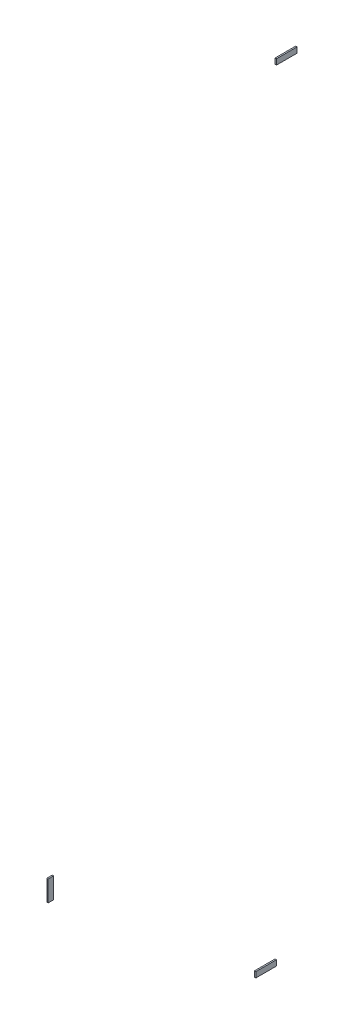
ISO-10303-21;
HEADER;
FILE_DESCRIPTION(('STEP AP214'),'2;1');
FILE_NAME('part.step','',(''),(''),'','','');
FILE_SCHEMA(('AUTOMOTIVE_DESIGN { 1 0 10303 214 1 1 1 1 }'));
ENDSEC;
DATA;
#1=APPLICATION_CONTEXT('core data for automotive mechanical design processes');
#2=APPLICATION_PROTOCOL_DEFINITION('international standard','automotive_design',2000,#1);
#3=PRODUCT_CONTEXT('',#1,'mechanical');
#4=PRODUCT('Part','Part','',(#3));
#5=PRODUCT_RELATED_PRODUCT_CATEGORY('part','',(#4));
#6=PRODUCT_DEFINITION_FORMATION('','',#4);
#7=PRODUCT_DEFINITION_CONTEXT('part definition',#1,'design');
#8=PRODUCT_DEFINITION('design','',#6,#7);
#9=PRODUCT_DEFINITION_SHAPE('','',#8);
#10=(LENGTH_UNIT() NAMED_UNIT(*) SI_UNIT(.MILLI.,.METRE.));
#11=(NAMED_UNIT(*) PLANE_ANGLE_UNIT() SI_UNIT($,.RADIAN.));
#12=(NAMED_UNIT(*) SI_UNIT($,.STERADIAN.) SOLID_ANGLE_UNIT());
#13=UNCERTAINTY_MEASURE_WITH_UNIT(LENGTH_MEASURE(1.E-05),#10,'distance_accuracy_value','');
#14=(GEOMETRIC_REPRESENTATION_CONTEXT(3) GLOBAL_UNCERTAINTY_ASSIGNED_CONTEXT((#13)) GLOBAL_UNIT_ASSIGNED_CONTEXT((#10,
#11,#12)) REPRESENTATION_CONTEXT('',''));
#15=CARTESIAN_POINT('',(0.,0.,0.));
#16=DIRECTION('',(0.,0.,1.));
#17=DIRECTION('',(1.,0.,0.));
#18=AXIS2_PLACEMENT_3D('',#15,#16,#17);
#19=CARTESIAN_POINT('',(113.80183648763,26.9498798221227,74.0750036621569));
#20=DIRECTION('',(-1.,0.,0.));
#21=DIRECTION('',(0.,0.,1.));
#22=AXIS2_PLACEMENT_3D('',#19,#20,#21);
#23=PLANE('',#22);
#24=DIRECTION('',(0.,1.,0.));
#25=VECTOR('',#24,1.);
#26=CARTESIAN_POINT('',(113.80183648763,20.3498798221227,75.575003662157));
#27=LINE('',#26,#25);
#28=CARTESIAN_POINT('',(113.80183648763,26.5498798221227,75.5750036621569));
#29=VERTEX_POINT('',#28);
#30=CARTESIAN_POINT('',(113.80183648763,27.3498798221227,75.5750036621569));
#31=VERTEX_POINT('',#30);
#32=EDGE_CURVE('P0_E11',#29,#31,#27,.T.);
#33=ORIENTED_EDGE('',*,*,#32,.T.);
#34=DIRECTION('',(0.,0.,-1.));
#35=VECTOR('',#34,1.);
#36=CARTESIAN_POINT('',(113.80183648763,27.3498798221227,75.5750036621569));
#37=LINE('',#36,#35);
#38=CARTESIAN_POINT('',(113.80183648763,27.3498798221227,72.5750036621568));
#39=VERTEX_POINT('',#38);
#40=EDGE_CURVE('P0_E57',#31,#39,#37,.T.);
#41=ORIENTED_EDGE('',*,*,#40,.T.);
#42=DIRECTION('',(0.,-1.,0.));
#43=VECTOR('',#42,1.);
#44=CARTESIAN_POINT('',(113.80183648763,27.3498798221227,72.5750036621568));
#45=LINE('',#44,#43);
#46=CARTESIAN_POINT('',(113.80183648763,26.5498798221227,72.5750036621569));
#47=VERTEX_POINT('',#46);
#48=EDGE_CURVE('P0_E60',#39,#47,#45,.T.);
#49=ORIENTED_EDGE('',*,*,#48,.T.);
#50=DIRECTION('',(0.,0.,1.));
#51=VECTOR('',#50,1.);
#52=CARTESIAN_POINT('',(113.80183648763,26.5498798221227,75.5750036621569));
#53=LINE('',#52,#51);
#54=EDGE_CURVE('P0_E111',#47,#29,#53,.T.);
#55=ORIENTED_EDGE('',*,*,#54,.T.);
#56=EDGE_LOOP('',(#33,#41,#49,#55));
#57=FACE_BOUND('',#56,.T.);
#58=ADVANCED_FACE('P0_F17',(#57),#23,.T.);
#59=CARTESIAN_POINT('',(114.00183648763,26.9498798221227,74.0750036621569));
#60=DIRECTION('',(1.,0.,0.));
#61=DIRECTION('',(0.,1.,0.));
#62=AXIS2_PLACEMENT_3D('',#59,#60,#61);
#63=PLANE('',#62);
#64=DIRECTION('',(0.,1.,0.));
#65=VECTOR('',#64,1.);
#66=CARTESIAN_POINT('',(114.00183648763,20.3498798221227,75.575003662157));
#67=LINE('',#66,#65);
#68=CARTESIAN_POINT('',(114.00183648763,26.5498798221227,75.5750036621569));
#69=VERTEX_POINT('',#68);
#70=CARTESIAN_POINT('',(114.00183648763,27.3498798221227,75.5750036621569));
#71=VERTEX_POINT('',#70);
#72=EDGE_CURVE('P0_E26',#69,#71,#67,.T.);
#73=ORIENTED_EDGE('',*,*,#72,.F.);
#74=DIRECTION('',(0.,0.,-1.));
#75=VECTOR('',#74,1.);
#76=CARTESIAN_POINT('',(114.00183648763,26.5498798221227,75.5750036621569));
#77=LINE('',#76,#75);
#78=CARTESIAN_POINT('',(114.00183648763,26.5498798221227,72.5750036621569));
#79=VERTEX_POINT('',#78);
#80=EDGE_CURVE('P0_E108',#69,#79,#77,.T.);
#81=ORIENTED_EDGE('',*,*,#80,.T.);
#82=DIRECTION('',(0.,-1.,0.));
#83=VECTOR('',#82,1.);
#84=CARTESIAN_POINT('',(114.00183648763,27.3498798221227,72.5750036621568));
#85=LINE('',#84,#83);
#86=CARTESIAN_POINT('',(114.00183648763,27.3498798221227,72.5750036621568));
#87=VERTEX_POINT('',#86);
#88=EDGE_CURVE('P0_E82',#87,#79,#85,.T.);
#89=ORIENTED_EDGE('',*,*,#88,.F.);
#90=DIRECTION('',(0.,0.,-1.));
#91=VECTOR('',#90,1.);
#92=CARTESIAN_POINT('',(114.00183648763,27.3498798221227,75.5750036621569));
#93=LINE('',#92,#91);
#94=EDGE_CURVE('P0_E66',#71,#87,#93,.T.);
#95=ORIENTED_EDGE('',*,*,#94,.F.);
#96=EDGE_LOOP('',(#73,#81,#89,#95));
#97=FACE_BOUND('',#96,.T.);
#98=ADVANCED_FACE('P0_F107',(#97),#63,.T.);
#99=CARTESIAN_POINT('',(114.00183648763,26.5498798221227,75.5750036621569));
#100=DIRECTION('',(0.,0.,1.));
#101=DIRECTION('',(0.,-1.,0.));
#102=AXIS2_PLACEMENT_3D('',#99,#100,#101);
#103=PLANE('',#102);
#104=ORIENTED_EDGE('',*,*,#72,.T.);
#105=DIRECTION('',(-1.,0.,0.));
#106=VECTOR('',#105,1.);
#107=CARTESIAN_POINT('',(114.00183648763,27.3498798221227,75.5750036621569));
#108=LINE('',#107,#106);
#109=EDGE_CURVE('P0_E65',#71,#31,#108,.T.);
#110=ORIENTED_EDGE('',*,*,#109,.T.);
#111=ORIENTED_EDGE('',*,*,#32,.F.);
#112=DIRECTION('',(-1.,0.,0.));
#113=VECTOR('',#112,1.);
#114=CARTESIAN_POINT('',(114.00183648763,26.5498798221227,75.5750036621569));
#115=LINE('',#114,#113);
#116=EDGE_CURVE('P0_E103',#69,#29,#115,.T.);
#117=ORIENTED_EDGE('',*,*,#116,.F.);
#118=EDGE_LOOP('',(#104,#110,#111,#117));
#119=FACE_BOUND('',#118,.T.);
#120=ADVANCED_FACE('P0_F100',(#119),#103,.T.);
#121=CARTESIAN_POINT('',(114.00183648763,27.3498798221227,75.5750036621569));
#122=DIRECTION('',(0.,1.,0.));
#123=DIRECTION('',(0.,0.,-1.));
#124=AXIS2_PLACEMENT_3D('',#121,#122,#123);
#125=PLANE('',#124);
#126=ORIENTED_EDGE('',*,*,#94,.T.);
#127=DIRECTION('',(-1.,0.,0.));
#128=VECTOR('',#127,1.);
#129=CARTESIAN_POINT('',(114.00183648763,27.3498798221227,72.5750036621568));
#130=LINE('',#129,#128);
#131=EDGE_CURVE('P0_E69',#87,#39,#130,.T.);
#132=ORIENTED_EDGE('',*,*,#131,.T.);
#133=ORIENTED_EDGE('',*,*,#40,.F.);
#134=ORIENTED_EDGE('',*,*,#109,.F.);
#135=EDGE_LOOP('',(#126,#132,#133,#134));
#136=FACE_BOUND('',#135,.T.);
#137=ADVANCED_FACE('P0_F70',(#136),#125,.T.);
#138=CARTESIAN_POINT('',(114.00183648763,27.3498798221227,72.5750036621568));
#139=DIRECTION('',(0.,0.,-1.));
#140=DIRECTION('',(0.,-1.,0.));
#141=AXIS2_PLACEMENT_3D('',#138,#139,#140);
#142=PLANE('',#141);
#143=ORIENTED_EDGE('',*,*,#88,.T.);
#144=DIRECTION('',(-1.,0.,0.));
#145=VECTOR('',#144,1.);
#146=CARTESIAN_POINT('',(114.00183648763,26.5498798221227,72.5750036621569));
#147=LINE('',#146,#145);
#148=EDGE_CURVE('P0_E79',#79,#47,#147,.T.);
#149=ORIENTED_EDGE('',*,*,#148,.T.);
#150=ORIENTED_EDGE('',*,*,#48,.F.);
#151=ORIENTED_EDGE('',*,*,#131,.F.);
#152=EDGE_LOOP('',(#143,#149,#150,#151));
#153=FACE_BOUND('',#152,.T.);
#154=ADVANCED_FACE('P0_F77',(#153),#142,.T.);
#155=CARTESIAN_POINT('',(114.00183648763,26.5498798221227,72.5750036621569));
#156=DIRECTION('',(0.,-1.,0.));
#157=DIRECTION('',(-1.,0.,0.));
#158=AXIS2_PLACEMENT_3D('',#155,#156,#157);
#159=PLANE('',#158);
#160=ORIENTED_EDGE('',*,*,#80,.F.);
#161=ORIENTED_EDGE('',*,*,#116,.T.);
#162=ORIENTED_EDGE('',*,*,#54,.F.);
#163=ORIENTED_EDGE('',*,*,#148,.F.);
#164=EDGE_LOOP('',(#160,#161,#162,#163));
#165=FACE_BOUND('',#164,.T.);
#166=ADVANCED_FACE('P0_F110',(#165),#159,.T.);
#167=CLOSED_SHELL('',(#58,#98,#120,#137,#154,#166));
#168=MANIFOLD_SOLID_BREP('P0_B1',#167);
#169=CARTESIAN_POINT('',(113.80183648763,-86.2501201778774,77.0750036621583));
#170=DIRECTION('',(-1.,0.,0.));
#171=DIRECTION('',(0.,0.,1.));
#172=AXIS2_PLACEMENT_3D('',#169,#170,#171);
#173=PLANE('',#172);
#174=DIRECTION('',(0.,0.,1.));
#175=VECTOR('',#174,1.);
#176=CARTESIAN_POINT('',(113.80183648763,-86.6501201778774,78.5750036621584));
#177=LINE('',#176,#175);
#178=CARTESIAN_POINT('',(113.80183648763,-86.6501201778775,75.5750036621582));
#179=VERTEX_POINT('',#178);
#180=CARTESIAN_POINT('',(113.80183648763,-86.6501201778774,78.5750036621584));
#181=VERTEX_POINT('',#180);
#182=EDGE_CURVE('P1_E11',#179,#181,#177,.T.);
#183=ORIENTED_EDGE('',*,*,#182,.T.);
#184=DIRECTION('',(0.,1.,0.));
#185=VECTOR('',#184,1.);
#186=CARTESIAN_POINT('',(113.80183648763,-86.6501201778774,78.5750036621584));
#187=LINE('',#186,#185);
#188=CARTESIAN_POINT('',(113.80183648763,-85.8501201778774,78.5750036621584));
#189=VERTEX_POINT('',#188);
#190=EDGE_CURVE('P1_E115',#181,#189,#187,.T.);
#191=ORIENTED_EDGE('',*,*,#190,.T.);
#192=DIRECTION('',(0.,0.,-1.));
#193=VECTOR('',#192,1.);
#194=CARTESIAN_POINT('',(113.80183648763,-85.8501201778774,78.5750036621584));
#195=LINE('',#194,#193);
#196=CARTESIAN_POINT('',(113.80183648763,-85.8501201778775,75.5750036621582));
#197=VERTEX_POINT('',#196);
#198=EDGE_CURVE('P1_E65',#189,#197,#195,.T.);
#199=ORIENTED_EDGE('',*,*,#198,.T.);
#200=DIRECTION('',(0.,-1.,0.));
#201=VECTOR('',#200,1.);
#202=CARTESIAN_POINT('',(113.80183648763,-83.6501201778775,75.5750036621582));
#203=LINE('',#202,#201);
#204=EDGE_CURVE('P1_E94',#197,#179,#203,.T.);
#205=ORIENTED_EDGE('',*,*,#204,.T.);
#206=EDGE_LOOP('',(#183,#191,#199,#205));
#207=FACE_BOUND('',#206,.T.);
#208=ADVANCED_FACE('P1_F17',(#207),#173,.T.);
#209=CARTESIAN_POINT('',(114.00183648763,-86.2501201778774,77.0750036621583));
#210=DIRECTION('',(1.,0.,0.));
#211=DIRECTION('',(0.,1.,0.));
#212=AXIS2_PLACEMENT_3D('',#209,#210,#211);
#213=PLANE('',#212);
#214=DIRECTION('',(0.,0.,-1.));
#215=VECTOR('',#214,1.);
#216=CARTESIAN_POINT('',(114.00183648763,-86.6501201778774,78.5750036621584));
#217=LINE('',#216,#215);
#218=CARTESIAN_POINT('',(114.00183648763,-86.6501201778774,78.5750036621584));
#219=VERTEX_POINT('',#218);
#220=CARTESIAN_POINT('',(114.00183648763,-86.6501201778775,75.5750036621582));
#221=VERTEX_POINT('',#220);
#222=EDGE_CURVE('P1_E25',#219,#221,#217,.T.);
#223=ORIENTED_EDGE('',*,*,#222,.T.);
#224=DIRECTION('',(0.,-1.,0.));
#225=VECTOR('',#224,1.);
#226=CARTESIAN_POINT('',(114.00183648763,-83.6501201778775,75.5750036621582));
#227=LINE('',#226,#225);
#228=CARTESIAN_POINT('',(114.00183648763,-85.8501201778775,75.5750036621582));
#229=VERTEX_POINT('',#228);
#230=EDGE_CURVE('P1_E93',#229,#221,#227,.T.);
#231=ORIENTED_EDGE('',*,*,#230,.F.);
#232=DIRECTION('',(0.,0.,-1.));
#233=VECTOR('',#232,1.);
#234=CARTESIAN_POINT('',(114.00183648763,-85.8501201778774,78.5750036621584));
#235=LINE('',#234,#233);
#236=CARTESIAN_POINT('',(114.00183648763,-85.8501201778774,78.5750036621584));
#237=VERTEX_POINT('',#236);
#238=EDGE_CURVE('P1_E79',#237,#229,#235,.T.);
#239=ORIENTED_EDGE('',*,*,#238,.F.);
#240=DIRECTION('',(0.,1.,0.));
#241=VECTOR('',#240,1.);
#242=CARTESIAN_POINT('',(114.00183648763,-86.6501201778774,78.5750036621584));
#243=LINE('',#242,#241);
#244=EDGE_CURVE('P1_E58',#219,#237,#243,.T.);
#245=ORIENTED_EDGE('',*,*,#244,.F.);
#246=EDGE_LOOP('',(#223,#231,#239,#245));
#247=FACE_BOUND('',#246,.T.);
#248=ADVANCED_FACE('P1_F97',(#247),#213,.T.);
#249=CARTESIAN_POINT('',(114.00183648763,-86.6501201778775,75.5750036621582));
#250=DIRECTION('',(0.,-1.,0.));
#251=DIRECTION('',(-1.,0.,0.));
#252=AXIS2_PLACEMENT_3D('',#249,#250,#251);
#253=PLANE('',#252);
#254=ORIENTED_EDGE('',*,*,#222,.F.);
#255=DIRECTION('',(-1.,0.,0.));
#256=VECTOR('',#255,1.);
#257=CARTESIAN_POINT('',(114.00183648763,-86.6501201778774,78.5750036621584));
#258=LINE('',#257,#256);
#259=EDGE_CURVE('P1_E118',#219,#181,#258,.T.);
#260=ORIENTED_EDGE('',*,*,#259,.T.);
#261=ORIENTED_EDGE('',*,*,#182,.F.);
#262=DIRECTION('',(-1.,0.,0.));
#263=VECTOR('',#262,1.);
#264=CARTESIAN_POINT('',(114.00183648763,-86.6501201778775,75.5750036621582));
#265=LINE('',#264,#263);
#266=EDGE_CURVE('P1_E99',#221,#179,#265,.T.);
#267=ORIENTED_EDGE('',*,*,#266,.F.);
#268=EDGE_LOOP('',(#254,#260,#261,#267));
#269=FACE_BOUND('',#268,.T.);
#270=ADVANCED_FACE('P1_F185',(#269),#253,.T.);
#271=CARTESIAN_POINT('',(114.00183648763,-86.6501201778774,78.5750036621584));
#272=DIRECTION('',(0.,0.,1.));
#273=DIRECTION('',(0.,-1.,0.));
#274=AXIS2_PLACEMENT_3D('',#271,#272,#273);
#275=PLANE('',#274);
#276=ORIENTED_EDGE('',*,*,#244,.T.);
#277=DIRECTION('',(-1.,0.,0.));
#278=VECTOR('',#277,1.);
#279=CARTESIAN_POINT('',(114.00183648763,-85.8501201778774,78.5750036621584));
#280=LINE('',#279,#278);
#281=EDGE_CURVE('P1_E84',#237,#189,#280,.T.);
#282=ORIENTED_EDGE('',*,*,#281,.T.);
#283=ORIENTED_EDGE('',*,*,#190,.F.);
#284=ORIENTED_EDGE('',*,*,#259,.F.);
#285=EDGE_LOOP('',(#276,#282,#283,#284));
#286=FACE_BOUND('',#285,.T.);
#287=ADVANCED_FACE('P1_F174',(#286),#275,.T.);
#288=CARTESIAN_POINT('',(114.00183648763,-85.8501201778774,78.5750036621584));
#289=DIRECTION('',(0.,1.,0.));
#290=DIRECTION('',(0.,0.,-1.));
#291=AXIS2_PLACEMENT_3D('',#288,#289,#290);
#292=PLANE('',#291);
#293=ORIENTED_EDGE('',*,*,#238,.T.);
#294=DIRECTION('',(-1.,0.,0.));
#295=VECTOR('',#294,1.);
#296=CARTESIAN_POINT('',(114.00183648763,-85.8501201778775,75.5750036621582));
#297=LINE('',#296,#295);
#298=EDGE_CURVE('P1_E82',#229,#197,#297,.T.);
#299=ORIENTED_EDGE('',*,*,#298,.T.);
#300=ORIENTED_EDGE('',*,*,#198,.F.);
#301=ORIENTED_EDGE('',*,*,#281,.F.);
#302=EDGE_LOOP('',(#293,#299,#300,#301));
#303=FACE_BOUND('',#302,.T.);
#304=ADVANCED_FACE('P1_F81',(#303),#292,.T.);
#305=CARTESIAN_POINT('',(114.00183648763,-85.8501201778775,75.5750036621582));
#306=DIRECTION('',(0.,0.,-1.));
#307=DIRECTION('',(0.,-1.,0.));
#308=AXIS2_PLACEMENT_3D('',#305,#306,#307);
#309=PLANE('',#308);
#310=ORIENTED_EDGE('',*,*,#230,.T.);
#311=ORIENTED_EDGE('',*,*,#266,.T.);
#312=ORIENTED_EDGE('',*,*,#204,.F.);
#313=ORIENTED_EDGE('',*,*,#298,.F.);
#314=EDGE_LOOP('',(#310,#311,#312,#313));
#315=FACE_BOUND('',#314,.T.);
#316=ADVANCED_FACE('P1_F91',(#315),#309,.T.);
#317=CLOSED_SHELL('',(#208,#248,#270,#287,#304,#316));
#318=MANIFOLD_SOLID_BREP('P1_B1',#317);
#319=CARTESIAN_POINT('',(113.80183648763,-60.650120177877,108.300003662157));
#320=DIRECTION('',(-1.,0.,0.));
#321=DIRECTION('',(0.,0.,1.));
#322=AXIS2_PLACEMENT_3D('',#319,#320,#321);
#323=PLANE('',#322);
#324=DIRECTION('',(0.,0.,1.));
#325=VECTOR('',#324,1.);
#326=CARTESIAN_POINT('',(113.80183648763,-62.150120177877,101.700003662157));
#327=LINE('',#326,#325);
#328=CARTESIAN_POINT('',(113.80183648763,-62.150120177877,107.900003662157));
#329=VERTEX_POINT('',#328);
#330=CARTESIAN_POINT('',(113.80183648763,-62.150120177877,108.700003662157));
#331=VERTEX_POINT('',#330);
#332=EDGE_CURVE('P2_E11',#329,#331,#327,.T.);
#333=ORIENTED_EDGE('',*,*,#332,.T.);
#334=DIRECTION('',(0.,1.,0.));
#335=VECTOR('',#334,1.);
#336=CARTESIAN_POINT('',(113.80183648763,-62.150120177877,108.700003662157));
#337=LINE('',#336,#335);
#338=CARTESIAN_POINT('',(113.80183648763,-59.150120177877,108.700003662157));
#339=VERTEX_POINT('',#338);
#340=EDGE_CURVE('P2_E111',#331,#339,#337,.T.);
#341=ORIENTED_EDGE('',*,*,#340,.T.);
#342=DIRECTION('',(0.,0.,-1.));
#343=VECTOR('',#342,1.);
#344=CARTESIAN_POINT('',(113.80183648763,-59.150120177877,108.700003662157));
#345=LINE('',#344,#343);
#346=CARTESIAN_POINT('',(113.80183648763,-59.150120177877,107.900003662157));
#347=VERTEX_POINT('',#346);
#348=EDGE_CURVE('P2_E102',#339,#347,#345,.T.);
#349=ORIENTED_EDGE('',*,*,#348,.T.);
#350=DIRECTION('',(0.,-1.,0.));
#351=VECTOR('',#350,1.);
#352=CARTESIAN_POINT('',(113.80183648763,-62.150120177877,107.900003662157));
#353=LINE('',#352,#351);
#354=EDGE_CURVE('P2_E83',#347,#329,#353,.T.);
#355=ORIENTED_EDGE('',*,*,#354,.T.);
#356=EDGE_LOOP('',(#333,#341,#349,#355));
#357=FACE_BOUND('',#356,.T.);
#358=ADVANCED_FACE('P2_F17',(#357),#323,.T.);
#359=CARTESIAN_POINT('',(114.00183648763,-60.650120177877,108.300003662157));
#360=DIRECTION('',(1.,0.,0.));
#361=DIRECTION('',(0.,1.,0.));
#362=AXIS2_PLACEMENT_3D('',#359,#360,#361);
#363=PLANE('',#362);
#364=DIRECTION('',(0.,0.,1.));
#365=VECTOR('',#364,1.);
#366=CARTESIAN_POINT('',(114.00183648763,-62.150120177877,101.700003662157));
#367=LINE('',#366,#365);
#368=CARTESIAN_POINT('',(114.00183648763,-62.150120177877,107.900003662157));
#369=VERTEX_POINT('',#368);
#370=CARTESIAN_POINT('',(114.00183648763,-62.150120177877,108.700003662157));
#371=VERTEX_POINT('',#370);
#372=EDGE_CURVE('P2_E27',#369,#371,#367,.T.);
#373=ORIENTED_EDGE('',*,*,#372,.F.);
#374=DIRECTION('',(0.,1.,0.));
#375=VECTOR('',#374,1.);
#376=CARTESIAN_POINT('',(114.00183648763,-62.150120177877,107.900003662157));
#377=LINE('',#376,#375);
#378=CARTESIAN_POINT('',(114.00183648763,-59.150120177877,107.900003662157));
#379=VERTEX_POINT('',#378);
#380=EDGE_CURVE('P2_E74',#369,#379,#377,.T.);
#381=ORIENTED_EDGE('',*,*,#380,.T.);
#382=DIRECTION('',(0.,0.,-1.));
#383=VECTOR('',#382,1.);
#384=CARTESIAN_POINT('',(114.00183648763,-59.150120177877,108.700003662157));
#385=LINE('',#384,#383);
#386=CARTESIAN_POINT('',(114.00183648763,-59.150120177877,108.700003662157));
#387=VERTEX_POINT('',#386);
#388=EDGE_CURVE('P2_E99',#387,#379,#385,.T.);
#389=ORIENTED_EDGE('',*,*,#388,.F.);
#390=DIRECTION('',(0.,1.,0.));
#391=VECTOR('',#390,1.);
#392=CARTESIAN_POINT('',(114.00183648763,-62.150120177877,108.700003662157));
#393=LINE('',#392,#391);
#394=EDGE_CURVE('P2_E75',#371,#387,#393,.T.);
#395=ORIENTED_EDGE('',*,*,#394,.F.);
#396=EDGE_LOOP('',(#373,#381,#389,#395));
#397=FACE_BOUND('',#396,.T.);
#398=ADVANCED_FACE('P2_F19',(#397),#363,.T.);
#399=CARTESIAN_POINT('',(114.00183648763,-62.150120177877,107.900003662157));
#400=DIRECTION('',(0.,-1.,0.));
#401=DIRECTION('',(0.,0.,-1.));
#402=AXIS2_PLACEMENT_3D('',#399,#400,#401);
#403=PLANE('',#402);
#404=ORIENTED_EDGE('',*,*,#372,.T.);
#405=DIRECTION('',(-1.,0.,0.));
#406=VECTOR('',#405,1.);
#407=CARTESIAN_POINT('',(114.00183648763,-62.150120177877,108.700003662157));
#408=LINE('',#407,#406);
#409=EDGE_CURVE('P2_E21',#371,#331,#408,.T.);
#410=ORIENTED_EDGE('',*,*,#409,.T.);
#411=ORIENTED_EDGE('',*,*,#332,.F.);
#412=DIRECTION('',(-1.,0.,0.));
#413=VECTOR('',#412,1.);
#414=CARTESIAN_POINT('',(114.00183648763,-62.150120177877,107.900003662157));
#415=LINE('',#414,#413);
#416=EDGE_CURVE('P2_E78',#369,#329,#415,.T.);
#417=ORIENTED_EDGE('',*,*,#416,.F.);
#418=EDGE_LOOP('',(#404,#410,#411,#417));
#419=FACE_BOUND('',#418,.T.);
#420=ADVANCED_FACE('P2_F79',(#419),#403,.T.);
#421=CARTESIAN_POINT('',(114.00183648763,-62.150120177877,108.700003662157));
#422=DIRECTION('',(0.,0.,1.));
#423=DIRECTION('',(0.,-1.,0.));
#424=AXIS2_PLACEMENT_3D('',#421,#422,#423);
#425=PLANE('',#424);
#426=ORIENTED_EDGE('',*,*,#394,.T.);
#427=DIRECTION('',(-1.,0.,0.));
#428=VECTOR('',#427,1.);
#429=CARTESIAN_POINT('',(114.00183648763,-59.150120177877,108.700003662157));
#430=LINE('',#429,#428);
#431=EDGE_CURVE('P2_E105',#387,#339,#430,.T.);
#432=ORIENTED_EDGE('',*,*,#431,.T.);
#433=ORIENTED_EDGE('',*,*,#340,.F.);
#434=ORIENTED_EDGE('',*,*,#409,.F.);
#435=EDGE_LOOP('',(#426,#432,#433,#434));
#436=FACE_BOUND('',#435,.T.);
#437=ADVANCED_FACE('P2_F120',(#436),#425,.T.);
#438=CARTESIAN_POINT('',(114.00183648763,-59.150120177877,108.700003662157));
#439=DIRECTION('',(0.,1.,0.));
#440=DIRECTION('',(1.,0.,0.));
#441=AXIS2_PLACEMENT_3D('',#438,#439,#440);
#442=PLANE('',#441);
#443=ORIENTED_EDGE('',*,*,#388,.T.);
#444=DIRECTION('',(-1.,0.,0.));
#445=VECTOR('',#444,1.);
#446=CARTESIAN_POINT('',(114.00183648763,-59.150120177877,107.900003662157));
#447=LINE('',#446,#445);
#448=EDGE_CURVE('P2_E88',#379,#347,#447,.T.);
#449=ORIENTED_EDGE('',*,*,#448,.T.);
#450=ORIENTED_EDGE('',*,*,#348,.F.);
#451=ORIENTED_EDGE('',*,*,#431,.F.);
#452=EDGE_LOOP('',(#443,#449,#450,#451));
#453=FACE_BOUND('',#452,.T.);
#454=ADVANCED_FACE('P2_F124',(#453),#442,.T.);
#455=CARTESIAN_POINT('',(114.00183648763,-59.150120177877,107.900003662157));
#456=DIRECTION('',(0.,0.,-1.));
#457=DIRECTION('',(0.,-1.,0.));
#458=AXIS2_PLACEMENT_3D('',#455,#456,#457);
#459=PLANE('',#458);
#460=ORIENTED_EDGE('',*,*,#380,.F.);
#461=ORIENTED_EDGE('',*,*,#416,.T.);
#462=ORIENTED_EDGE('',*,*,#354,.F.);
#463=ORIENTED_EDGE('',*,*,#448,.F.);
#464=EDGE_LOOP('',(#460,#461,#462,#463));
#465=FACE_BOUND('',#464,.T.);
#466=ADVANCED_FACE('P2_F86',(#465),#459,.T.);
#467=CLOSED_SHELL('',(#358,#398,#420,#437,#454,#466));
#468=MANIFOLD_SOLID_BREP('P2_B1',#467);
#469=ADVANCED_BREP_SHAPE_REPRESENTATION('',(#18,#168,#318,#468),#14);
#470=SHAPE_DEFINITION_REPRESENTATION(#9,#469);
ENDSEC;
END-ISO-10303-21;
